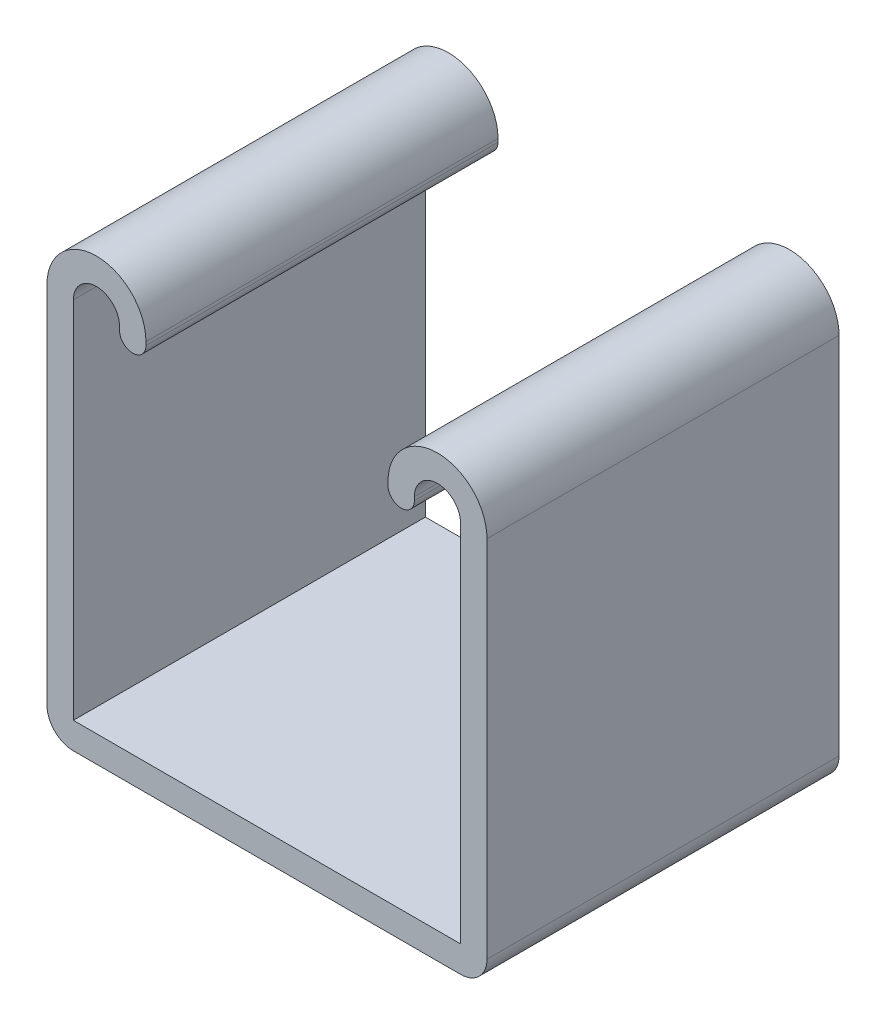
ISO-10303-21;
HEADER;
FILE_DESCRIPTION(('STEP AP214'),'2;1');
FILE_NAME('part.step','',(''),(''),'','','');
FILE_SCHEMA(('AUTOMOTIVE_DESIGN { 1 0 10303 214 1 1 1 1 }'));
ENDSEC;
DATA;
#1=APPLICATION_CONTEXT('core data for automotive mechanical design processes');
#2=APPLICATION_PROTOCOL_DEFINITION('international standard','automotive_design',2000,#1);
#3=PRODUCT_CONTEXT('',#1,'mechanical');
#4=PRODUCT('Part','Part','',(#3));
#5=PRODUCT_RELATED_PRODUCT_CATEGORY('part','',(#4));
#6=PRODUCT_DEFINITION_FORMATION('','',#4);
#7=PRODUCT_DEFINITION_CONTEXT('part definition',#1,'design');
#8=PRODUCT_DEFINITION('design','',#6,#7);
#9=PRODUCT_DEFINITION_SHAPE('','',#8);
#10=(LENGTH_UNIT() NAMED_UNIT(*) SI_UNIT(.MILLI.,.METRE.));
#11=(NAMED_UNIT(*) PLANE_ANGLE_UNIT() SI_UNIT($,.RADIAN.));
#12=(NAMED_UNIT(*) SI_UNIT($,.STERADIAN.) SOLID_ANGLE_UNIT());
#13=UNCERTAINTY_MEASURE_WITH_UNIT(LENGTH_MEASURE(1.E-05),#10,'distance_accuracy_value','');
#14=(GEOMETRIC_REPRESENTATION_CONTEXT(3) GLOBAL_UNCERTAINTY_ASSIGNED_CONTEXT((#13)) GLOBAL_UNIT_ASSIGNED_CONTEXT((#10,
#11,#12)) REPRESENTATION_CONTEXT('',''));
#15=CARTESIAN_POINT('',(0.,0.,0.));
#16=DIRECTION('',(0.,0.,1.));
#17=DIRECTION('',(1.,0.,0.));
#18=AXIS2_PLACEMENT_3D('',#15,#16,#17);
#19=CARTESIAN_POINT('',(-12.303125,14.360525,12.7));
#20=DIRECTION('',(0.,0.,-1.));
#21=DIRECTION('',(-1.,0.,0.));
#22=AXIS2_PLACEMENT_3D('',#19,#20,#21);
#23=CYLINDRICAL_SURFACE('',#22,3.571875);
#24=CARTESIAN_POINT('',(-12.303125,14.360525,-12.7));
#25=DIRECTION('',(0.,0.,1.));
#26=DIRECTION('',(-1.,0.,0.));
#27=AXIS2_PLACEMENT_3D('',#24,#25,#26);
#28=CIRCLE('',#27,3.571875);
#29=CARTESIAN_POINT('',(-8.73125,14.360525,-12.7));
#30=VERTEX_POINT('',#29);
#31=CARTESIAN_POINT('',(-15.875,14.360525,-12.7));
#32=VERTEX_POINT('',#31);
#33=EDGE_CURVE('E188',#30,#32,#28,.T.);
#34=ORIENTED_EDGE('',*,*,#33,.T.);
#35=DIRECTION('',(0.,0.,-1.));
#36=VECTOR('',#35,1.);
#37=CARTESIAN_POINT('',(-15.875,14.360525,12.7));
#38=LINE('',#37,#36);
#39=CARTESIAN_POINT('',(-15.875,14.360525,12.7));
#40=VERTEX_POINT('',#39);
#41=EDGE_CURVE('E11',#40,#32,#38,.T.);
#42=ORIENTED_EDGE('',*,*,#41,.F.);
#43=CARTESIAN_POINT('',(-12.303125,14.360525,12.7));
#44=DIRECTION('',(0.,0.,1.));
#45=DIRECTION('',(-1.,0.,0.));
#46=AXIS2_PLACEMENT_3D('',#43,#44,#45);
#47=CIRCLE('',#46,3.571875);
#48=CARTESIAN_POINT('',(-8.73125,14.360525,12.7));
#49=VERTEX_POINT('',#48);
#50=EDGE_CURVE('E222',#49,#40,#47,.T.);
#51=ORIENTED_EDGE('',*,*,#50,.F.);
#52=DIRECTION('',(0.,0.,-1.));
#53=VECTOR('',#52,1.);
#54=CARTESIAN_POINT('',(-8.73125,14.360525,12.7));
#55=LINE('',#54,#53);
#56=EDGE_CURVE('E184',#49,#30,#55,.T.);
#57=ORIENTED_EDGE('',*,*,#56,.T.);
#58=EDGE_LOOP('',(#34,#42,#51,#57));
#59=FACE_BOUND('',#58,.T.);
#60=ADVANCED_FACE('F32',(#59),#23,.T.);
#61=CARTESIAN_POINT('',(-15.875,14.360525,12.7));
#62=DIRECTION('',(1.,0.,0.));
#63=DIRECTION('',(0.,1.,0.));
#64=AXIS2_PLACEMENT_3D('',#61,#62,#63);
#65=PLANE('',#64);
#66=DIRECTION('',(0.,-1.,0.));
#67=VECTOR('',#66,1.);
#68=CARTESIAN_POINT('',(-15.875,14.360525,-12.7));
#69=LINE('',#68,#67);
#70=CARTESIAN_POINT('',(-15.875,-11.9126,-12.7));
#71=VERTEX_POINT('',#70);
#72=EDGE_CURVE('E191',#32,#71,#69,.T.);
#73=ORIENTED_EDGE('',*,*,#72,.T.);
#74=DIRECTION('',(0.,0.,-1.));
#75=VECTOR('',#74,1.);
#76=CARTESIAN_POINT('',(-15.875,-11.9126,12.7));
#77=LINE('',#76,#75);
#78=CARTESIAN_POINT('',(-15.875,-11.9126,12.7));
#79=VERTEX_POINT('',#78);
#80=EDGE_CURVE('E40',#79,#71,#77,.T.);
#81=ORIENTED_EDGE('',*,*,#80,.F.);
#82=DIRECTION('',(0.,-1.,0.));
#83=VECTOR('',#82,1.);
#84=CARTESIAN_POINT('',(-15.875,14.360525,12.7));
#85=LINE('',#84,#83);
#86=EDGE_CURVE('E121',#40,#79,#85,.T.);
#87=ORIENTED_EDGE('',*,*,#86,.F.);
#88=ORIENTED_EDGE('',*,*,#41,.T.);
#89=EDGE_LOOP('',(#73,#81,#87,#88));
#90=FACE_BOUND('',#89,.T.);
#91=ADVANCED_FACE('F330',(#90),#65,.F.);
#92=CARTESIAN_POINT('',(-13.97,-11.9126,12.7));
#93=DIRECTION('',(0.,0.,-1.));
#94=DIRECTION('',(-1.,0.,0.));
#95=AXIS2_PLACEMENT_3D('',#92,#93,#94);
#96=CYLINDRICAL_SURFACE('',#95,1.905);
#97=CARTESIAN_POINT('',(-13.97,-11.9126,-12.7));
#98=DIRECTION('',(0.,0.,1.));
#99=DIRECTION('',(-1.,0.,0.));
#100=AXIS2_PLACEMENT_3D('',#97,#98,#99);
#101=CIRCLE('',#100,1.905);
#102=CARTESIAN_POINT('',(-13.97,-13.8176,-12.7));
#103=VERTEX_POINT('',#102);
#104=EDGE_CURVE('E193',#71,#103,#101,.T.);
#105=ORIENTED_EDGE('',*,*,#104,.T.);
#106=DIRECTION('',(0.,0.,-1.));
#107=VECTOR('',#106,1.);
#108=CARTESIAN_POINT('',(-13.97,-13.8176,12.7));
#109=LINE('',#108,#107);
#110=CARTESIAN_POINT('',(-13.97,-13.8176,12.7));
#111=VERTEX_POINT('',#110);
#112=EDGE_CURVE('E259',#111,#103,#109,.T.);
#113=ORIENTED_EDGE('',*,*,#112,.F.);
#114=CARTESIAN_POINT('',(-13.97,-11.9126,12.7));
#115=DIRECTION('',(0.,0.,1.));
#116=DIRECTION('',(-1.,0.,0.));
#117=AXIS2_PLACEMENT_3D('',#114,#115,#116);
#118=CIRCLE('',#117,1.905);
#119=EDGE_CURVE('E267',#79,#111,#118,.T.);
#120=ORIENTED_EDGE('',*,*,#119,.F.);
#121=ORIENTED_EDGE('',*,*,#80,.T.);
#122=EDGE_LOOP('',(#105,#113,#120,#121));
#123=FACE_BOUND('',#122,.T.);
#124=ADVANCED_FACE('F265',(#123),#96,.T.);
#125=CARTESIAN_POINT('',(-13.97,-13.8176,12.7));
#126=DIRECTION('',(0.,1.,0.));
#127=DIRECTION('',(-1.,0.,0.));
#128=AXIS2_PLACEMENT_3D('',#125,#126,#127);
#129=PLANE('',#128);
#130=DIRECTION('',(1.,0.,0.));
#131=VECTOR('',#130,1.);
#132=CARTESIAN_POINT('',(-13.97,-13.8176,-12.7));
#133=LINE('',#132,#131);
#134=CARTESIAN_POINT('',(13.97,-13.8176,-12.7));
#135=VERTEX_POINT('',#134);
#136=EDGE_CURVE('E195',#103,#135,#133,.T.);
#137=ORIENTED_EDGE('',*,*,#136,.T.);
#138=DIRECTION('',(0.,0.,-1.));
#139=VECTOR('',#138,1.);
#140=CARTESIAN_POINT('',(13.97,-13.8176,12.7));
#141=LINE('',#140,#139);
#142=CARTESIAN_POINT('',(13.97,-13.8176,12.7));
#143=VERTEX_POINT('',#142);
#144=EDGE_CURVE('E256',#143,#135,#141,.T.);
#145=ORIENTED_EDGE('',*,*,#144,.F.);
#146=DIRECTION('',(1.,0.,0.));
#147=VECTOR('',#146,1.);
#148=CARTESIAN_POINT('',(-13.97,-13.8176,12.7));
#149=LINE('',#148,#147);
#150=EDGE_CURVE('E285',#111,#143,#149,.T.);
#151=ORIENTED_EDGE('',*,*,#150,.F.);
#152=ORIENTED_EDGE('',*,*,#112,.T.);
#153=EDGE_LOOP('',(#137,#145,#151,#152));
#154=FACE_BOUND('',#153,.T.);
#155=ADVANCED_FACE('F276',(#154),#129,.F.);
#156=CARTESIAN_POINT('',(13.97,-11.9126,12.7));
#157=DIRECTION('',(0.,0.,-1.));
#158=DIRECTION('',(-1.,0.,0.));
#159=AXIS2_PLACEMENT_3D('',#156,#157,#158);
#160=CYLINDRICAL_SURFACE('',#159,1.905);
#161=CARTESIAN_POINT('',(13.97,-11.9126,-12.7));
#162=DIRECTION('',(0.,0.,1.));
#163=DIRECTION('',(1.,0.,0.));
#164=AXIS2_PLACEMENT_3D('',#161,#162,#163);
#165=CIRCLE('',#164,1.905);
#166=CARTESIAN_POINT('',(15.875,-11.9126,-12.7));
#167=VERTEX_POINT('',#166);
#168=EDGE_CURVE('E197',#135,#167,#165,.T.);
#169=ORIENTED_EDGE('',*,*,#168,.T.);
#170=DIRECTION('',(0.,0.,-1.));
#171=VECTOR('',#170,1.);
#172=CARTESIAN_POINT('',(15.875,-11.9126,12.7));
#173=LINE('',#172,#171);
#174=CARTESIAN_POINT('',(15.875,-11.9126,12.7));
#175=VERTEX_POINT('',#174);
#176=EDGE_CURVE('E253',#175,#167,#173,.T.);
#177=ORIENTED_EDGE('',*,*,#176,.F.);
#178=CARTESIAN_POINT('',(13.97,-11.9126,12.7));
#179=DIRECTION('',(0.,0.,1.));
#180=DIRECTION('',(1.,0.,0.));
#181=AXIS2_PLACEMENT_3D('',#178,#179,#180);
#182=CIRCLE('',#181,1.905);
#183=EDGE_CURVE('E282',#143,#175,#182,.T.);
#184=ORIENTED_EDGE('',*,*,#183,.F.);
#185=ORIENTED_EDGE('',*,*,#144,.T.);
#186=EDGE_LOOP('',(#169,#177,#184,#185));
#187=FACE_BOUND('',#186,.T.);
#188=ADVANCED_FACE('F280',(#187),#160,.T.);
#189=CARTESIAN_POINT('',(15.875,-11.9126,12.7));
#190=DIRECTION('',(-1.,0.,0.));
#191=DIRECTION('',(0.,0.,1.));
#192=AXIS2_PLACEMENT_3D('',#189,#190,#191);
#193=PLANE('',#192);
#194=DIRECTION('',(0.,1.,0.));
#195=VECTOR('',#194,1.);
#196=CARTESIAN_POINT('',(15.875,-11.9126,-12.7));
#197=LINE('',#196,#195);
#198=CARTESIAN_POINT('',(15.875,14.360525,-12.7));
#199=VERTEX_POINT('',#198);
#200=EDGE_CURVE('E199',#167,#199,#197,.T.);
#201=ORIENTED_EDGE('',*,*,#200,.T.);
#202=DIRECTION('',(0.,0.,-1.));
#203=VECTOR('',#202,1.);
#204=CARTESIAN_POINT('',(15.875,14.360525,12.7));
#205=LINE('',#204,#203);
#206=CARTESIAN_POINT('',(15.875,14.360525,12.7));
#207=VERTEX_POINT('',#206);
#208=EDGE_CURVE('E250',#207,#199,#205,.T.);
#209=ORIENTED_EDGE('',*,*,#208,.F.);
#210=DIRECTION('',(0.,1.,0.));
#211=VECTOR('',#210,1.);
#212=CARTESIAN_POINT('',(15.875,-11.9126,12.7));
#213=LINE('',#212,#211);
#214=EDGE_CURVE('E284',#175,#207,#213,.T.);
#215=ORIENTED_EDGE('',*,*,#214,.F.);
#216=ORIENTED_EDGE('',*,*,#176,.T.);
#217=EDGE_LOOP('',(#201,#209,#215,#216));
#218=FACE_BOUND('',#217,.T.);
#219=ADVANCED_FACE('F343',(#218),#193,.F.);
#220=CARTESIAN_POINT('',(12.303125,14.360525,12.7));
#221=DIRECTION('',(0.,0.,-1.));
#222=DIRECTION('',(-1.,0.,0.));
#223=AXIS2_PLACEMENT_3D('',#220,#221,#222);
#224=CYLINDRICAL_SURFACE('',#223,3.571875);
#225=CARTESIAN_POINT('',(12.303125,14.360525,-12.7));
#226=DIRECTION('',(0.,0.,1.));
#227=DIRECTION('',(1.,0.,0.));
#228=AXIS2_PLACEMENT_3D('',#225,#226,#227);
#229=CIRCLE('',#228,3.571875);
#230=CARTESIAN_POINT('',(8.73125,14.360525,-12.7));
#231=VERTEX_POINT('',#230);
#232=EDGE_CURVE('E201',#199,#231,#229,.T.);
#233=ORIENTED_EDGE('',*,*,#232,.T.);
#234=DIRECTION('',(0.,0.,-1.));
#235=VECTOR('',#234,1.);
#236=CARTESIAN_POINT('',(8.73125,14.360525,12.7));
#237=LINE('',#236,#235);
#238=CARTESIAN_POINT('',(8.73125,14.360525,12.7));
#239=VERTEX_POINT('',#238);
#240=EDGE_CURVE('E247',#239,#231,#237,.T.);
#241=ORIENTED_EDGE('',*,*,#240,.F.);
#242=CARTESIAN_POINT('',(12.303125,14.360525,12.7));
#243=DIRECTION('',(0.,0.,1.));
#244=DIRECTION('',(1.,0.,0.));
#245=AXIS2_PLACEMENT_3D('',#242,#243,#244);
#246=CIRCLE('',#245,3.571875);
#247=EDGE_CURVE('E287',#207,#239,#246,.T.);
#248=ORIENTED_EDGE('',*,*,#247,.F.);
#249=ORIENTED_EDGE('',*,*,#208,.T.);
#250=EDGE_LOOP('',(#233,#241,#248,#249));
#251=FACE_BOUND('',#250,.T.);
#252=ADVANCED_FACE('F346',(#251),#224,.T.);
#253=CARTESIAN_POINT('',(8.73125,14.360525,12.7));
#254=DIRECTION('',(1.,0.,0.));
#255=DIRECTION('',(0.,0.,-1.));
#256=AXIS2_PLACEMENT_3D('',#253,#254,#255);
#257=PLANE('',#256);
#258=DIRECTION('',(0.,-1.,0.));
#259=VECTOR('',#258,1.);
#260=CARTESIAN_POINT('',(8.73125,14.360525,-12.7));
#261=LINE('',#260,#259);
#262=CARTESIAN_POINT('',(8.73125,14.1224,-12.7));
#263=VERTEX_POINT('',#262);
#264=EDGE_CURVE('E203',#231,#263,#261,.T.);
#265=ORIENTED_EDGE('',*,*,#264,.T.);
#266=DIRECTION('',(0.,0.,-1.));
#267=VECTOR('',#266,1.);
#268=CARTESIAN_POINT('',(8.73125,14.1224,12.7));
#269=LINE('',#268,#267);
#270=CARTESIAN_POINT('',(8.73125,14.1224,12.7));
#271=VERTEX_POINT('',#270);
#272=EDGE_CURVE('E244',#271,#263,#269,.T.);
#273=ORIENTED_EDGE('',*,*,#272,.F.);
#274=DIRECTION('',(0.,-1.,0.));
#275=VECTOR('',#274,1.);
#276=CARTESIAN_POINT('',(8.73125,14.360525,12.7));
#277=LINE('',#276,#275);
#278=EDGE_CURVE('E293',#239,#271,#277,.T.);
#279=ORIENTED_EDGE('',*,*,#278,.F.);
#280=ORIENTED_EDGE('',*,*,#240,.T.);
#281=EDGE_LOOP('',(#265,#273,#279,#280));
#282=FACE_BOUND('',#281,.T.);
#283=ADVANCED_FACE('F350',(#282),#257,.F.);
#284=CARTESIAN_POINT('',(9.68375,14.1224,12.7));
#285=DIRECTION('',(0.,0.,-1.));
#286=DIRECTION('',(-1.,0.,0.));
#287=AXIS2_PLACEMENT_3D('',#284,#285,#286);
#288=CYLINDRICAL_SURFACE('',#287,0.9525);
#289=CARTESIAN_POINT('',(9.68375,14.1224,-12.7));
#290=DIRECTION('',(0.,0.,1.));
#291=DIRECTION('',(1.,0.,0.));
#292=AXIS2_PLACEMENT_3D('',#289,#290,#291);
#293=CIRCLE('',#292,0.9525);
#294=CARTESIAN_POINT('',(10.63625,14.1224,-12.7));
#295=VERTEX_POINT('',#294);
#296=EDGE_CURVE('E205',#263,#295,#293,.T.);
#297=ORIENTED_EDGE('',*,*,#296,.T.);
#298=DIRECTION('',(0.,0.,-1.));
#299=VECTOR('',#298,1.);
#300=CARTESIAN_POINT('',(10.63625,14.1224,12.7));
#301=LINE('',#300,#299);
#302=CARTESIAN_POINT('',(10.63625,14.1224,12.7));
#303=VERTEX_POINT('',#302);
#304=EDGE_CURVE('E241',#303,#295,#301,.T.);
#305=ORIENTED_EDGE('',*,*,#304,.F.);
#306=CARTESIAN_POINT('',(9.68375,14.1224,12.7));
#307=DIRECTION('',(0.,0.,1.));
#308=DIRECTION('',(1.,0.,0.));
#309=AXIS2_PLACEMENT_3D('',#306,#307,#308);
#310=CIRCLE('',#309,0.9525);
#311=EDGE_CURVE('E295',#271,#303,#310,.T.);
#312=ORIENTED_EDGE('',*,*,#311,.F.);
#313=ORIENTED_EDGE('',*,*,#272,.T.);
#314=EDGE_LOOP('',(#297,#305,#312,#313));
#315=FACE_BOUND('',#314,.T.);
#316=ADVANCED_FACE('F354',(#315),#288,.T.);
#317=CARTESIAN_POINT('',(10.63625,14.360525,12.7));
#318=DIRECTION('',(-1.,0.,0.));
#319=DIRECTION('',(0.,0.,1.));
#320=AXIS2_PLACEMENT_3D('',#317,#318,#319);
#321=PLANE('',#320);
#322=DIRECTION('',(0.,1.,0.));
#323=VECTOR('',#322,1.);
#324=CARTESIAN_POINT('',(10.63625,14.360525,-12.7));
#325=LINE('',#324,#323);
#326=CARTESIAN_POINT('',(10.63625,14.360525,-12.7));
#327=VERTEX_POINT('',#326);
#328=EDGE_CURVE('E207',#295,#327,#325,.T.);
#329=ORIENTED_EDGE('',*,*,#328,.T.);
#330=DIRECTION('',(0.,0.,-1.));
#331=VECTOR('',#330,1.);
#332=CARTESIAN_POINT('',(10.63625,14.360525,12.7));
#333=LINE('',#332,#331);
#334=CARTESIAN_POINT('',(10.63625,14.360525,12.7));
#335=VERTEX_POINT('',#334);
#336=EDGE_CURVE('E238',#335,#327,#333,.T.);
#337=ORIENTED_EDGE('',*,*,#336,.F.);
#338=DIRECTION('',(0.,1.,0.));
#339=VECTOR('',#338,1.);
#340=CARTESIAN_POINT('',(10.63625,14.360525,12.7));
#341=LINE('',#340,#339);
#342=EDGE_CURVE('E297',#303,#335,#341,.T.);
#343=ORIENTED_EDGE('',*,*,#342,.F.);
#344=ORIENTED_EDGE('',*,*,#304,.T.);
#345=EDGE_LOOP('',(#329,#337,#343,#344));
#346=FACE_BOUND('',#345,.T.);
#347=ADVANCED_FACE('F358',(#346),#321,.F.);
#348=CARTESIAN_POINT('',(12.303125,14.360525,12.7));
#349=DIRECTION('',(0.,0.,-1.));
#350=DIRECTION('',(-1.,0.,0.));
#351=AXIS2_PLACEMENT_3D('',#348,#349,#350);
#352=CYLINDRICAL_SURFACE('',#351,1.666875);
#353=CARTESIAN_POINT('',(12.303125,14.360525,-12.7));
#354=DIRECTION('',(0.,0.,-1.));
#355=DIRECTION('',(1.,0.,0.));
#356=AXIS2_PLACEMENT_3D('',#353,#354,#355);
#357=CIRCLE('',#356,1.666875);
#358=CARTESIAN_POINT('',(13.97,14.360525,-12.7));
#359=VERTEX_POINT('',#358);
#360=EDGE_CURVE('E209',#327,#359,#357,.T.);
#361=ORIENTED_EDGE('',*,*,#360,.T.);
#362=DIRECTION('',(0.,0.,-1.));
#363=VECTOR('',#362,1.);
#364=CARTESIAN_POINT('',(13.97,14.360525,12.7));
#365=LINE('',#364,#363);
#366=CARTESIAN_POINT('',(13.97,14.360525,12.7));
#367=VERTEX_POINT('',#366);
#368=EDGE_CURVE('E235',#367,#359,#365,.T.);
#369=ORIENTED_EDGE('',*,*,#368,.F.);
#370=CARTESIAN_POINT('',(12.303125,14.360525,12.7));
#371=DIRECTION('',(0.,0.,-1.));
#372=DIRECTION('',(1.,0.,0.));
#373=AXIS2_PLACEMENT_3D('',#370,#371,#372);
#374=CIRCLE('',#373,1.666875);
#375=EDGE_CURVE('E299',#335,#367,#374,.T.);
#376=ORIENTED_EDGE('',*,*,#375,.F.);
#377=ORIENTED_EDGE('',*,*,#336,.T.);
#378=EDGE_LOOP('',(#361,#369,#376,#377));
#379=FACE_BOUND('',#378,.T.);
#380=ADVANCED_FACE('F362',(#379),#352,.F.);
#381=CARTESIAN_POINT('',(13.97,-11.9126,12.7));
#382=DIRECTION('',(1.,0.,0.));
#383=DIRECTION('',(0.,0.,-1.));
#384=AXIS2_PLACEMENT_3D('',#381,#382,#383);
#385=PLANE('',#384);
#386=DIRECTION('',(0.,-1.,0.));
#387=VECTOR('',#386,1.);
#388=CARTESIAN_POINT('',(13.97,-11.9126,-12.7));
#389=LINE('',#388,#387);
#390=CARTESIAN_POINT('',(13.97,-11.9126,-12.7));
#391=VERTEX_POINT('',#390);
#392=EDGE_CURVE('E211',#359,#391,#389,.T.);
#393=ORIENTED_EDGE('',*,*,#392,.T.);
#394=DIRECTION('',(0.,0.,-1.));
#395=VECTOR('',#394,1.);
#396=CARTESIAN_POINT('',(13.97,-11.9126,12.7));
#397=LINE('',#396,#395);
#398=CARTESIAN_POINT('',(13.97,-11.9126,12.7));
#399=VERTEX_POINT('',#398);
#400=EDGE_CURVE('E232',#399,#391,#397,.T.);
#401=ORIENTED_EDGE('',*,*,#400,.F.);
#402=DIRECTION('',(0.,-1.,0.));
#403=VECTOR('',#402,1.);
#404=CARTESIAN_POINT('',(13.97,-11.9126,12.7));
#405=LINE('',#404,#403);
#406=EDGE_CURVE('E301',#367,#399,#405,.T.);
#407=ORIENTED_EDGE('',*,*,#406,.F.);
#408=ORIENTED_EDGE('',*,*,#368,.T.);
#409=EDGE_LOOP('',(#393,#401,#407,#408));
#410=FACE_BOUND('',#409,.T.);
#411=ADVANCED_FACE('F366',(#410),#385,.F.);
#412=CARTESIAN_POINT('',(-13.97,-11.9126,12.7));
#413=DIRECTION('',(0.,-1.,0.));
#414=DIRECTION('',(0.,0.,-1.));
#415=AXIS2_PLACEMENT_3D('',#412,#413,#414);
#416=PLANE('',#415);
#417=DIRECTION('',(-1.,0.,0.));
#418=VECTOR('',#417,1.);
#419=CARTESIAN_POINT('',(-13.97,-11.9126,-12.7));
#420=LINE('',#419,#418);
#421=CARTESIAN_POINT('',(-13.97,-11.9126,-12.7));
#422=VERTEX_POINT('',#421);
#423=EDGE_CURVE('E213',#391,#422,#420,.T.);
#424=ORIENTED_EDGE('',*,*,#423,.T.);
#425=DIRECTION('',(0.,0.,-1.));
#426=VECTOR('',#425,1.);
#427=CARTESIAN_POINT('',(-13.97,-11.9126,12.7));
#428=LINE('',#427,#426);
#429=CARTESIAN_POINT('',(-13.97,-11.9126,12.7));
#430=VERTEX_POINT('',#429);
#431=EDGE_CURVE('E229',#430,#422,#428,.T.);
#432=ORIENTED_EDGE('',*,*,#431,.F.);
#433=DIRECTION('',(-1.,0.,0.));
#434=VECTOR('',#433,1.);
#435=CARTESIAN_POINT('',(-13.97,-11.9126,12.7));
#436=LINE('',#435,#434);
#437=EDGE_CURVE('E303',#399,#430,#436,.T.);
#438=ORIENTED_EDGE('',*,*,#437,.F.);
#439=ORIENTED_EDGE('',*,*,#400,.T.);
#440=EDGE_LOOP('',(#424,#432,#438,#439));
#441=FACE_BOUND('',#440,.T.);
#442=ADVANCED_FACE('F370',(#441),#416,.F.);
#443=CARTESIAN_POINT('',(-13.97,14.360525,12.7));
#444=DIRECTION('',(-1.,0.,0.));
#445=DIRECTION('',(0.,-1.,0.));
#446=AXIS2_PLACEMENT_3D('',#443,#444,#445);
#447=PLANE('',#446);
#448=DIRECTION('',(0.,1.,0.));
#449=VECTOR('',#448,1.);
#450=CARTESIAN_POINT('',(-13.97,14.360525,-12.7));
#451=LINE('',#450,#449);
#452=CARTESIAN_POINT('',(-13.97,14.360525,-12.7));
#453=VERTEX_POINT('',#452);
#454=EDGE_CURVE('E215',#422,#453,#451,.T.);
#455=ORIENTED_EDGE('',*,*,#454,.T.);
#456=DIRECTION('',(0.,0.,-1.));
#457=VECTOR('',#456,1.);
#458=CARTESIAN_POINT('',(-13.97,14.360525,12.7));
#459=LINE('',#458,#457);
#460=CARTESIAN_POINT('',(-13.97,14.360525,12.7));
#461=VERTEX_POINT('',#460);
#462=EDGE_CURVE('E226',#461,#453,#459,.T.);
#463=ORIENTED_EDGE('',*,*,#462,.F.);
#464=DIRECTION('',(0.,1.,0.));
#465=VECTOR('',#464,1.);
#466=CARTESIAN_POINT('',(-13.97,14.360525,12.7));
#467=LINE('',#466,#465);
#468=EDGE_CURVE('E305',#430,#461,#467,.T.);
#469=ORIENTED_EDGE('',*,*,#468,.F.);
#470=ORIENTED_EDGE('',*,*,#431,.T.);
#471=EDGE_LOOP('',(#455,#463,#469,#470));
#472=FACE_BOUND('',#471,.T.);
#473=ADVANCED_FACE('F311',(#472),#447,.F.);
#474=CARTESIAN_POINT('',(-12.303125,14.360525,12.7));
#475=DIRECTION('',(0.,0.,-1.));
#476=DIRECTION('',(-1.,0.,0.));
#477=AXIS2_PLACEMENT_3D('',#474,#475,#476);
#478=CYLINDRICAL_SURFACE('',#477,1.666875);
#479=CARTESIAN_POINT('',(-12.303125,14.360525,-12.7));
#480=DIRECTION('',(0.,0.,-1.));
#481=DIRECTION('',(-1.,0.,0.));
#482=AXIS2_PLACEMENT_3D('',#479,#480,#481);
#483=CIRCLE('',#482,1.666875);
#484=CARTESIAN_POINT('',(-10.63625,14.360525,-12.7));
#485=VERTEX_POINT('',#484);
#486=EDGE_CURVE('E217',#453,#485,#483,.T.);
#487=ORIENTED_EDGE('',*,*,#486,.T.);
#488=DIRECTION('',(0.,0.,-1.));
#489=VECTOR('',#488,1.);
#490=CARTESIAN_POINT('',(-10.63625,14.360525,12.7));
#491=LINE('',#490,#489);
#492=CARTESIAN_POINT('',(-10.63625,14.360525,12.7));
#493=VERTEX_POINT('',#492);
#494=EDGE_CURVE('E179',#493,#485,#491,.T.);
#495=ORIENTED_EDGE('',*,*,#494,.F.);
#496=CARTESIAN_POINT('',(-12.303125,14.360525,12.7));
#497=DIRECTION('',(0.,0.,-1.));
#498=DIRECTION('',(-1.,0.,0.));
#499=AXIS2_PLACEMENT_3D('',#496,#497,#498);
#500=CIRCLE('',#499,1.666875);
#501=EDGE_CURVE('E170',#461,#493,#500,.T.);
#502=ORIENTED_EDGE('',*,*,#501,.F.);
#503=ORIENTED_EDGE('',*,*,#462,.T.);
#504=EDGE_LOOP('',(#487,#495,#502,#503));
#505=FACE_BOUND('',#504,.T.);
#506=ADVANCED_FACE('F315',(#505),#478,.F.);
#507=CARTESIAN_POINT('',(-10.63625,14.360525,12.7));
#508=DIRECTION('',(1.,0.,0.));
#509=DIRECTION('',(0.,0.,-1.));
#510=AXIS2_PLACEMENT_3D('',#507,#508,#509);
#511=PLANE('',#510);
#512=DIRECTION('',(0.,-1.,0.));
#513=VECTOR('',#512,1.);
#514=CARTESIAN_POINT('',(-10.63625,14.360525,-12.7));
#515=LINE('',#514,#513);
#516=CARTESIAN_POINT('',(-10.63625,14.1224,-12.7));
#517=VERTEX_POINT('',#516);
#518=EDGE_CURVE('E178',#485,#517,#515,.T.);
#519=ORIENTED_EDGE('',*,*,#518,.T.);
#520=DIRECTION('',(0.,0.,-1.));
#521=VECTOR('',#520,1.);
#522=CARTESIAN_POINT('',(-10.63625,14.1224,12.7));
#523=LINE('',#522,#521);
#524=CARTESIAN_POINT('',(-10.63625,14.1224,12.7));
#525=VERTEX_POINT('',#524);
#526=EDGE_CURVE('E175',#525,#517,#523,.T.);
#527=ORIENTED_EDGE('',*,*,#526,.F.);
#528=DIRECTION('',(0.,-1.,0.));
#529=VECTOR('',#528,1.);
#530=CARTESIAN_POINT('',(-10.63625,14.360525,12.7));
#531=LINE('',#530,#529);
#532=EDGE_CURVE('E164',#493,#525,#531,.T.);
#533=ORIENTED_EDGE('',*,*,#532,.F.);
#534=ORIENTED_EDGE('',*,*,#494,.T.);
#535=EDGE_LOOP('',(#519,#527,#533,#534));
#536=FACE_BOUND('',#535,.T.);
#537=ADVANCED_FACE('F176',(#536),#511,.F.);
#538=CARTESIAN_POINT('',(-9.68375,14.1224,12.7));
#539=DIRECTION('',(0.,0.,-1.));
#540=DIRECTION('',(-1.,0.,0.));
#541=AXIS2_PLACEMENT_3D('',#538,#539,#540);
#542=CYLINDRICAL_SURFACE('',#541,0.9525);
#543=CARTESIAN_POINT('',(-9.68375,14.1224,-12.7));
#544=DIRECTION('',(0.,0.,1.));
#545=DIRECTION('',(-1.,0.,0.));
#546=AXIS2_PLACEMENT_3D('',#543,#544,#545);
#547=CIRCLE('',#546,0.9525);
#548=CARTESIAN_POINT('',(-8.73125,14.1224,-12.7));
#549=VERTEX_POINT('',#548);
#550=EDGE_CURVE('E107',#517,#549,#547,.T.);
#551=ORIENTED_EDGE('',*,*,#550,.T.);
#552=DIRECTION('',(0.,0.,-1.));
#553=VECTOR('',#552,1.);
#554=CARTESIAN_POINT('',(-8.73125,14.1224,12.7));
#555=LINE('',#554,#553);
#556=CARTESIAN_POINT('',(-8.73125,14.1224,12.7));
#557=VERTEX_POINT('',#556);
#558=EDGE_CURVE('E180',#557,#549,#555,.T.);
#559=ORIENTED_EDGE('',*,*,#558,.F.);
#560=CARTESIAN_POINT('',(-9.68375,14.1224,12.7));
#561=DIRECTION('',(0.,0.,1.));
#562=DIRECTION('',(-1.,0.,0.));
#563=AXIS2_PLACEMENT_3D('',#560,#561,#562);
#564=CIRCLE('',#563,0.9525);
#565=EDGE_CURVE('E168',#525,#557,#564,.T.);
#566=ORIENTED_EDGE('',*,*,#565,.F.);
#567=ORIENTED_EDGE('',*,*,#526,.T.);
#568=EDGE_LOOP('',(#551,#559,#566,#567));
#569=FACE_BOUND('',#568,.T.);
#570=ADVANCED_FACE('F182',(#569),#542,.T.);
#571=CARTESIAN_POINT('',(-8.73125,14.360525,12.7));
#572=DIRECTION('',(-1.,0.,0.));
#573=DIRECTION('',(0.,0.,1.));
#574=AXIS2_PLACEMENT_3D('',#571,#572,#573);
#575=PLANE('',#574);
#576=DIRECTION('',(0.,1.,0.));
#577=VECTOR('',#576,1.);
#578=CARTESIAN_POINT('',(-8.73125,14.360525,-12.7));
#579=LINE('',#578,#577);
#580=EDGE_CURVE('E113',#549,#30,#579,.T.);
#581=ORIENTED_EDGE('',*,*,#580,.T.);
#582=ORIENTED_EDGE('',*,*,#56,.F.);
#583=DIRECTION('',(0.,1.,0.));
#584=VECTOR('',#583,1.);
#585=CARTESIAN_POINT('',(-8.73125,14.360525,12.7));
#586=LINE('',#585,#584);
#587=EDGE_CURVE('E48',#557,#49,#586,.T.);
#588=ORIENTED_EDGE('',*,*,#587,.F.);
#589=ORIENTED_EDGE('',*,*,#558,.T.);
#590=EDGE_LOOP('',(#581,#582,#588,#589));
#591=FACE_BOUND('',#590,.T.);
#592=ADVANCED_FACE('F319',(#591),#575,.F.);
#593=CARTESIAN_POINT('',(-12.303125,14.360525,12.7));
#594=DIRECTION('',(0.,0.,-1.));
#595=DIRECTION('',(-1.,0.,0.));
#596=AXIS2_PLACEMENT_3D('',#593,#594,#595);
#597=PLANE('',#596);
#598=ORIENTED_EDGE('',*,*,#50,.T.);
#599=ORIENTED_EDGE('',*,*,#86,.T.);
#600=ORIENTED_EDGE('',*,*,#119,.T.);
#601=ORIENTED_EDGE('',*,*,#150,.T.);
#602=ORIENTED_EDGE('',*,*,#183,.T.);
#603=ORIENTED_EDGE('',*,*,#214,.T.);
#604=ORIENTED_EDGE('',*,*,#247,.T.);
#605=ORIENTED_EDGE('',*,*,#278,.T.);
#606=ORIENTED_EDGE('',*,*,#311,.T.);
#607=ORIENTED_EDGE('',*,*,#342,.T.);
#608=ORIENTED_EDGE('',*,*,#375,.T.);
#609=ORIENTED_EDGE('',*,*,#406,.T.);
#610=ORIENTED_EDGE('',*,*,#437,.T.);
#611=ORIENTED_EDGE('',*,*,#468,.T.);
#612=ORIENTED_EDGE('',*,*,#501,.T.);
#613=ORIENTED_EDGE('',*,*,#532,.T.);
#614=ORIENTED_EDGE('',*,*,#565,.T.);
#615=ORIENTED_EDGE('',*,*,#587,.T.);
#616=EDGE_LOOP('',(#598,#599,#600,#601,#602,#603,#604,#605,#606,#607,#608,#609,#610,#611,#612,
#613,#614,#615));
#617=FACE_BOUND('',#616,.T.);
#618=ADVANCED_FACE('F166',(#617),#597,.F.);
#619=CARTESIAN_POINT('',(-12.303125,14.360525,-12.7));
#620=DIRECTION('',(0.,0.,-1.));
#621=DIRECTION('',(-1.,0.,0.));
#622=AXIS2_PLACEMENT_3D('',#619,#620,#621);
#623=PLANE('',#622);
#624=ORIENTED_EDGE('',*,*,#33,.F.);
#625=ORIENTED_EDGE('',*,*,#580,.F.);
#626=ORIENTED_EDGE('',*,*,#550,.F.);
#627=ORIENTED_EDGE('',*,*,#518,.F.);
#628=ORIENTED_EDGE('',*,*,#486,.F.);
#629=ORIENTED_EDGE('',*,*,#454,.F.);
#630=ORIENTED_EDGE('',*,*,#423,.F.);
#631=ORIENTED_EDGE('',*,*,#392,.F.);
#632=ORIENTED_EDGE('',*,*,#360,.F.);
#633=ORIENTED_EDGE('',*,*,#328,.F.);
#634=ORIENTED_EDGE('',*,*,#296,.F.);
#635=ORIENTED_EDGE('',*,*,#264,.F.);
#636=ORIENTED_EDGE('',*,*,#232,.F.);
#637=ORIENTED_EDGE('',*,*,#200,.F.);
#638=ORIENTED_EDGE('',*,*,#168,.F.);
#639=ORIENTED_EDGE('',*,*,#136,.F.);
#640=ORIENTED_EDGE('',*,*,#104,.F.);
#641=ORIENTED_EDGE('',*,*,#72,.F.);
#642=EDGE_LOOP('',(#624,#625,#626,#627,#628,#629,#630,#631,#632,#633,#634,#635,#636,#637,#638,
#639,#640,#641));
#643=FACE_BOUND('',#642,.T.);
#644=ADVANCED_FACE('F271',(#643),#623,.T.);
#645=CLOSED_SHELL('',(#60,#91,#124,#155,#188,#219,#252,#283,#316,#347,#380,#411,#442,#473,#506,
#537,#570,#592,#618,#644));
#646=MANIFOLD_SOLID_BREP('B2',#645);
#647=ADVANCED_BREP_SHAPE_REPRESENTATION('',(#18,#646),#14);
#648=SHAPE_DEFINITION_REPRESENTATION(#9,#647);
ENDSEC;
END-ISO-10303-21;
